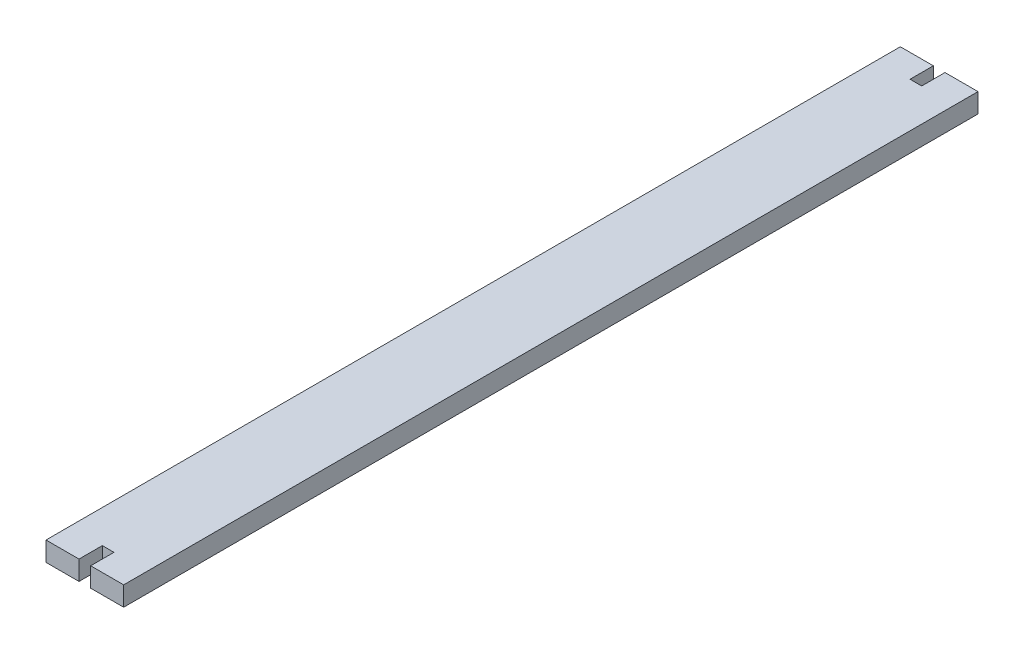
ISO-10303-21;
HEADER;
FILE_DESCRIPTION(('STEP AP214'),'2;1');
FILE_NAME('part.step','',(''),(''),'','','');
FILE_SCHEMA(('AUTOMOTIVE_DESIGN { 1 0 10303 214 1 1 1 1 }'));
ENDSEC;
DATA;
#1=APPLICATION_CONTEXT('core data for automotive mechanical design processes');
#2=APPLICATION_PROTOCOL_DEFINITION('international standard','automotive_design',2000,#1);
#3=PRODUCT_CONTEXT('',#1,'mechanical');
#4=PRODUCT('Part','Part','',(#3));
#5=PRODUCT_RELATED_PRODUCT_CATEGORY('part','',(#4));
#6=PRODUCT_DEFINITION_FORMATION('','',#4);
#7=PRODUCT_DEFINITION_CONTEXT('part definition',#1,'design');
#8=PRODUCT_DEFINITION('design','',#6,#7);
#9=PRODUCT_DEFINITION_SHAPE('','',#8);
#10=(LENGTH_UNIT() NAMED_UNIT(*) SI_UNIT(.MILLI.,.METRE.));
#11=(NAMED_UNIT(*) PLANE_ANGLE_UNIT() SI_UNIT($,.RADIAN.));
#12=(NAMED_UNIT(*) SI_UNIT($,.STERADIAN.) SOLID_ANGLE_UNIT());
#13=UNCERTAINTY_MEASURE_WITH_UNIT(LENGTH_MEASURE(1.E-05),#10,'distance_accuracy_value','');
#14=(GEOMETRIC_REPRESENTATION_CONTEXT(3) GLOBAL_UNCERTAINTY_ASSIGNED_CONTEXT((#13)) GLOBAL_UNIT_ASSIGNED_CONTEXT((#10,
#11,#12)) REPRESENTATION_CONTEXT('',''));
#15=CARTESIAN_POINT('',(0.,0.,0.));
#16=DIRECTION('',(0.,0.,1.));
#17=DIRECTION('',(1.,0.,0.));
#18=AXIS2_PLACEMENT_3D('',#15,#16,#17);
#19=CARTESIAN_POINT('',(10.,-5.,-110.));
#20=DIRECTION('',(0.,0.,-1.));
#21=DIRECTION('',(-1.,0.,0.));
#22=AXIS2_PLACEMENT_3D('',#19,#20,#21);
#23=PLANE('',#22);
#24=DIRECTION('',(0.,1.,0.));
#25=VECTOR('',#24,1.);
#26=CARTESIAN_POINT('',(-1.49999999999999,-5.,-110.));
#27=LINE('',#26,#25);
#28=CARTESIAN_POINT('',(-1.49999999999999,-5.,-110.));
#29=VERTEX_POINT('',#28);
#30=CARTESIAN_POINT('',(-1.49999999999999,0.,-110.));
#31=VERTEX_POINT('',#30);
#32=EDGE_CURVE('E163',#29,#31,#27,.T.);
#33=ORIENTED_EDGE('',*,*,#32,.F.);
#34=DIRECTION('',(-1.,0.,0.));
#35=VECTOR('',#34,1.);
#36=CARTESIAN_POINT('',(10.,-5.,-110.));
#37=LINE('',#36,#35);
#38=CARTESIAN_POINT('',(-9.99999999999999,-5.,-110.));
#39=VERTEX_POINT('',#38);
#40=EDGE_CURVE('E153',#29,#39,#37,.T.);
#41=ORIENTED_EDGE('',*,*,#40,.T.);
#42=DIRECTION('',(0.,1.,0.));
#43=VECTOR('',#42,1.);
#44=CARTESIAN_POINT('',(-9.99999999999999,-5.,-110.));
#45=LINE('',#44,#43);
#46=CARTESIAN_POINT('',(-9.99999999999999,0.,-110.));
#47=VERTEX_POINT('',#46);
#48=EDGE_CURVE('E11',#39,#47,#45,.T.);
#49=ORIENTED_EDGE('',*,*,#48,.T.);
#50=DIRECTION('',(-1.,0.,0.));
#51=VECTOR('',#50,1.);
#52=CARTESIAN_POINT('',(10.,0.,-110.));
#53=LINE('',#52,#51);
#54=EDGE_CURVE('E216',#31,#47,#53,.T.);
#55=ORIENTED_EDGE('',*,*,#54,.F.);
#56=EDGE_LOOP('',(#33,#41,#49,#55));
#57=FACE_BOUND('',#56,.T.);
#58=ADVANCED_FACE('F42',(#57),#23,.T.);
#59=CARTESIAN_POINT('',(10.,-5.,110.));
#60=DIRECTION('',(0.,0.,1.));
#61=DIRECTION('',(1.,0.,0.));
#62=AXIS2_PLACEMENT_3D('',#59,#60,#61);
#63=PLANE('',#62);
#64=DIRECTION('',(0.,1.,0.));
#65=VECTOR('',#64,1.);
#66=CARTESIAN_POINT('',(-1.5,-5.,110.));
#67=LINE('',#66,#65);
#68=CARTESIAN_POINT('',(-1.5,-5.,110.));
#69=VERTEX_POINT('',#68);
#70=CARTESIAN_POINT('',(-1.5,0.,110.));
#71=VERTEX_POINT('',#70);
#72=EDGE_CURVE('E170',#69,#71,#67,.T.);
#73=ORIENTED_EDGE('',*,*,#72,.T.);
#74=DIRECTION('',(1.,0.,0.));
#75=VECTOR('',#74,1.);
#76=CARTESIAN_POINT('',(10.,0.,110.));
#77=LINE('',#76,#75);
#78=CARTESIAN_POINT('',(-9.99999999999999,0.,110.));
#79=VERTEX_POINT('',#78);
#80=EDGE_CURVE('E210',#79,#71,#77,.T.);
#81=ORIENTED_EDGE('',*,*,#80,.F.);
#82=DIRECTION('',(0.,1.,0.));
#83=VECTOR('',#82,1.);
#84=CARTESIAN_POINT('',(-9.99999999999999,-5.,110.));
#85=LINE('',#84,#83);
#86=CARTESIAN_POINT('',(-9.99999999999999,-5.,110.));
#87=VERTEX_POINT('',#86);
#88=EDGE_CURVE('E46',#87,#79,#85,.T.);
#89=ORIENTED_EDGE('',*,*,#88,.F.);
#90=DIRECTION('',(1.,0.,0.));
#91=VECTOR('',#90,1.);
#92=CARTESIAN_POINT('',(10.,-5.,110.));
#93=LINE('',#92,#91);
#94=EDGE_CURVE('E198',#87,#69,#93,.T.);
#95=ORIENTED_EDGE('',*,*,#94,.T.);
#96=EDGE_LOOP('',(#73,#81,#89,#95));
#97=FACE_BOUND('',#96,.T.);
#98=ADVANCED_FACE('F231',(#97),#63,.T.);
#99=CARTESIAN_POINT('',(-9.99999999999999,-5.,110.));
#100=DIRECTION('',(-1.,0.,0.));
#101=DIRECTION('',(0.,0.,1.));
#102=AXIS2_PLACEMENT_3D('',#99,#100,#101);
#103=PLANE('',#102);
#104=DIRECTION('',(0.,0.,1.));
#105=VECTOR('',#104,1.);
#106=CARTESIAN_POINT('',(-9.99999999999999,0.,110.));
#107=LINE('',#106,#105);
#108=EDGE_CURVE('E165',#47,#79,#107,.T.);
#109=ORIENTED_EDGE('',*,*,#108,.F.);
#110=ORIENTED_EDGE('',*,*,#48,.F.);
#111=DIRECTION('',(0.,0.,1.));
#112=VECTOR('',#111,1.);
#113=CARTESIAN_POINT('',(-9.99999999999999,-5.,110.));
#114=LINE('',#113,#112);
#115=EDGE_CURVE('E193',#39,#87,#114,.T.);
#116=ORIENTED_EDGE('',*,*,#115,.T.);
#117=ORIENTED_EDGE('',*,*,#88,.T.);
#118=EDGE_LOOP('',(#109,#110,#116,#117));
#119=FACE_BOUND('',#118,.T.);
#120=ADVANCED_FACE('F44',(#119),#103,.T.);
#121=DIRECTION('',(0.,1.,0.));
#122=VECTOR('',#121,1.);
#123=CARTESIAN_POINT('',(1.50000000000001,-5.,-110.));
#124=LINE('',#123,#122);
#125=CARTESIAN_POINT('',(1.50000000000001,-5.,-110.));
#126=VERTEX_POINT('',#125);
#127=CARTESIAN_POINT('',(1.50000000000001,0.,-110.));
#128=VERTEX_POINT('',#127);
#129=EDGE_CURVE('E166',#126,#128,#124,.T.);
#130=ORIENTED_EDGE('',*,*,#129,.T.);
#131=CARTESIAN_POINT('',(10.,0.,-110.));
#132=VERTEX_POINT('',#131);
#133=EDGE_CURVE('E197',#132,#128,#53,.T.);
#134=ORIENTED_EDGE('',*,*,#133,.F.);
#135=DIRECTION('',(0.,1.,0.));
#136=VECTOR('',#135,1.);
#137=CARTESIAN_POINT('',(10.,-5.,-110.));
#138=LINE('',#137,#136);
#139=CARTESIAN_POINT('',(10.,-5.,-110.));
#140=VERTEX_POINT('',#139);
#141=EDGE_CURVE('E51',#140,#132,#138,.T.);
#142=ORIENTED_EDGE('',*,*,#141,.F.);
#143=EDGE_CURVE('E204',#140,#126,#37,.T.);
#144=ORIENTED_EDGE('',*,*,#143,.T.);
#145=EDGE_LOOP('',(#130,#134,#142,#144));
#146=FACE_BOUND('',#145,.T.);
#147=ADVANCED_FACE('F257',(#146),#23,.T.);
#148=CARTESIAN_POINT('',(10.,-5.,110.));
#149=DIRECTION('',(1.,0.,0.));
#150=DIRECTION('',(0.,0.,-1.));
#151=AXIS2_PLACEMENT_3D('',#148,#149,#150);
#152=PLANE('',#151);
#153=DIRECTION('',(0.,0.,-1.));
#154=VECTOR('',#153,1.);
#155=CARTESIAN_POINT('',(10.,0.,110.));
#156=LINE('',#155,#154);
#157=CARTESIAN_POINT('',(10.,0.,110.));
#158=VERTEX_POINT('',#157);
#159=EDGE_CURVE('E213',#158,#132,#156,.T.);
#160=ORIENTED_EDGE('',*,*,#159,.F.);
#161=DIRECTION('',(0.,1.,0.));
#162=VECTOR('',#161,1.);
#163=CARTESIAN_POINT('',(10.,-5.,110.));
#164=LINE('',#163,#162);
#165=CARTESIAN_POINT('',(10.,-5.,110.));
#166=VERTEX_POINT('',#165);
#167=EDGE_CURVE('E219',#166,#158,#164,.T.);
#168=ORIENTED_EDGE('',*,*,#167,.F.);
#169=DIRECTION('',(0.,0.,-1.));
#170=VECTOR('',#169,1.);
#171=CARTESIAN_POINT('',(10.,-5.,110.));
#172=LINE('',#171,#170);
#173=EDGE_CURVE('E201',#166,#140,#172,.T.);
#174=ORIENTED_EDGE('',*,*,#173,.T.);
#175=ORIENTED_EDGE('',*,*,#141,.T.);
#176=EDGE_LOOP('',(#160,#168,#174,#175));
#177=FACE_BOUND('',#176,.T.);
#178=ADVANCED_FACE('F266',(#177),#152,.T.);
#179=DIRECTION('',(0.,1.,0.));
#180=VECTOR('',#179,1.);
#181=CARTESIAN_POINT('',(1.49999999999999,-5.,110.));
#182=LINE('',#181,#180);
#183=CARTESIAN_POINT('',(1.49999999999999,-5.,110.));
#184=VERTEX_POINT('',#183);
#185=CARTESIAN_POINT('',(1.49999999999999,0.,110.));
#186=VERTEX_POINT('',#185);
#187=EDGE_CURVE('E67',#184,#186,#182,.T.);
#188=ORIENTED_EDGE('',*,*,#187,.F.);
#189=EDGE_CURVE('E196',#184,#166,#93,.T.);
#190=ORIENTED_EDGE('',*,*,#189,.T.);
#191=ORIENTED_EDGE('',*,*,#167,.T.);
#192=EDGE_CURVE('E209',#186,#158,#77,.T.);
#193=ORIENTED_EDGE('',*,*,#192,.F.);
#194=EDGE_LOOP('',(#188,#190,#191,#193));
#195=FACE_BOUND('',#194,.T.);
#196=ADVANCED_FACE('F262',(#195),#63,.T.);
#197=CARTESIAN_POINT('',(0.,-5.,0.));
#198=DIRECTION('',(0.,1.,0.));
#199=DIRECTION('',(0.,0.,1.));
#200=AXIS2_PLACEMENT_3D('',#197,#198,#199);
#201=PLANE('',#200);
#202=ORIENTED_EDGE('',*,*,#40,.F.);
#203=DIRECTION('',(0.,0.,1.));
#204=VECTOR('',#203,1.);
#205=CARTESIAN_POINT('',(-1.49999999999999,-5.,-104.));
#206=LINE('',#205,#204);
#207=CARTESIAN_POINT('',(-1.49999999999999,-5.,-104.));
#208=VERTEX_POINT('',#207);
#209=EDGE_CURVE('E135',#29,#208,#206,.T.);
#210=ORIENTED_EDGE('',*,*,#209,.T.);
#211=DIRECTION('',(1.,0.,0.));
#212=VECTOR('',#211,1.);
#213=CARTESIAN_POINT('',(1.50000000000001,-5.,-104.));
#214=LINE('',#213,#212);
#215=CARTESIAN_POINT('',(1.50000000000001,-5.,-104.));
#216=VERTEX_POINT('',#215);
#217=EDGE_CURVE('E144',#208,#216,#214,.T.);
#218=ORIENTED_EDGE('',*,*,#217,.T.);
#219=DIRECTION('',(0.,0.,-1.));
#220=VECTOR('',#219,1.);
#221=CARTESIAN_POINT('',(1.50000000000001,-5.,-104.));
#222=LINE('',#221,#220);
#223=EDGE_CURVE('E141',#216,#126,#222,.T.);
#224=ORIENTED_EDGE('',*,*,#223,.T.);
#225=ORIENTED_EDGE('',*,*,#143,.F.);
#226=ORIENTED_EDGE('',*,*,#173,.F.);
#227=ORIENTED_EDGE('',*,*,#189,.F.);
#228=DIRECTION('',(0.,0.,-1.));
#229=VECTOR('',#228,1.);
#230=CARTESIAN_POINT('',(1.49999999999999,-5.,104.));
#231=LINE('',#230,#229);
#232=CARTESIAN_POINT('',(1.49999999999999,-5.,104.));
#233=VERTEX_POINT('',#232);
#234=EDGE_CURVE('E188',#184,#233,#231,.T.);
#235=ORIENTED_EDGE('',*,*,#234,.T.);
#236=DIRECTION('',(-1.,0.,0.));
#237=VECTOR('',#236,1.);
#238=CARTESIAN_POINT('',(1.49999999999999,-5.,104.));
#239=LINE('',#238,#237);
#240=CARTESIAN_POINT('',(-1.5,-5.,104.));
#241=VERTEX_POINT('',#240);
#242=EDGE_CURVE('E173',#233,#241,#239,.T.);
#243=ORIENTED_EDGE('',*,*,#242,.T.);
#244=DIRECTION('',(0.,0.,1.));
#245=VECTOR('',#244,1.);
#246=CARTESIAN_POINT('',(-1.5,-5.,104.));
#247=LINE('',#246,#245);
#248=EDGE_CURVE('E183',#241,#69,#247,.T.);
#249=ORIENTED_EDGE('',*,*,#248,.T.);
#250=ORIENTED_EDGE('',*,*,#94,.F.);
#251=ORIENTED_EDGE('',*,*,#115,.F.);
#252=EDGE_LOOP('',(#202,#210,#218,#224,#225,#226,#227,#235,#243,#249,#250,#251));
#253=FACE_BOUND('',#252,.T.);
#254=ADVANCED_FACE('F151',(#253),#201,.F.);
#255=CARTESIAN_POINT('',(0.,0.,0.));
#256=DIRECTION('',(0.,1.,0.));
#257=DIRECTION('',(0.,0.,1.));
#258=AXIS2_PLACEMENT_3D('',#255,#256,#257);
#259=PLANE('',#258);
#260=DIRECTION('',(0.,0.,1.));
#261=VECTOR('',#260,1.);
#262=CARTESIAN_POINT('',(-1.49999999999999,0.,-104.));
#263=LINE('',#262,#261);
#264=CARTESIAN_POINT('',(-1.49999999999999,0.,-104.));
#265=VERTEX_POINT('',#264);
#266=EDGE_CURVE('E59',#31,#265,#263,.T.);
#267=ORIENTED_EDGE('',*,*,#266,.F.);
#268=ORIENTED_EDGE('',*,*,#54,.T.);
#269=ORIENTED_EDGE('',*,*,#108,.T.);
#270=ORIENTED_EDGE('',*,*,#80,.T.);
#271=DIRECTION('',(0.,0.,1.));
#272=VECTOR('',#271,1.);
#273=CARTESIAN_POINT('',(-1.5,0.,104.));
#274=LINE('',#273,#272);
#275=CARTESIAN_POINT('',(-1.5,0.,104.));
#276=VERTEX_POINT('',#275);
#277=EDGE_CURVE('E161',#276,#71,#274,.T.);
#278=ORIENTED_EDGE('',*,*,#277,.F.);
#279=DIRECTION('',(-1.,0.,0.));
#280=VECTOR('',#279,1.);
#281=CARTESIAN_POINT('',(1.49999999999999,0.,104.));
#282=LINE('',#281,#280);
#283=CARTESIAN_POINT('',(1.49999999999999,0.,104.));
#284=VERTEX_POINT('',#283);
#285=EDGE_CURVE('E179',#284,#276,#282,.T.);
#286=ORIENTED_EDGE('',*,*,#285,.F.);
#287=DIRECTION('',(0.,0.,-1.));
#288=VECTOR('',#287,1.);
#289=CARTESIAN_POINT('',(1.49999999999999,0.,104.));
#290=LINE('',#289,#288);
#291=EDGE_CURVE('E182',#186,#284,#290,.T.);
#292=ORIENTED_EDGE('',*,*,#291,.F.);
#293=ORIENTED_EDGE('',*,*,#192,.T.);
#294=ORIENTED_EDGE('',*,*,#159,.T.);
#295=ORIENTED_EDGE('',*,*,#133,.T.);
#296=DIRECTION('',(0.,0.,-1.));
#297=VECTOR('',#296,1.);
#298=CARTESIAN_POINT('',(1.50000000000001,0.,-104.));
#299=LINE('',#298,#297);
#300=CARTESIAN_POINT('',(1.50000000000001,0.,-104.));
#301=VERTEX_POINT('',#300);
#302=EDGE_CURVE('E154',#301,#128,#299,.T.);
#303=ORIENTED_EDGE('',*,*,#302,.F.);
#304=DIRECTION('',(1.,0.,0.));
#305=VECTOR('',#304,1.);
#306=CARTESIAN_POINT('',(1.50000000000001,0.,-104.));
#307=LINE('',#306,#305);
#308=EDGE_CURVE('E156',#265,#301,#307,.T.);
#309=ORIENTED_EDGE('',*,*,#308,.F.);
#310=EDGE_LOOP('',(#267,#268,#269,#270,#278,#286,#292,#293,#294,#295,#303,#309));
#311=FACE_BOUND('',#310,.T.);
#312=ADVANCED_FACE('F234',(#311),#259,.T.);
#313=CARTESIAN_POINT('',(-1.5,-5.,104.));
#314=DIRECTION('',(-1.,0.,0.));
#315=DIRECTION('',(0.,0.,1.));
#316=AXIS2_PLACEMENT_3D('',#313,#314,#315);
#317=PLANE('',#316);
#318=ORIENTED_EDGE('',*,*,#277,.T.);
#319=ORIENTED_EDGE('',*,*,#72,.F.);
#320=ORIENTED_EDGE('',*,*,#248,.F.);
#321=DIRECTION('',(0.,1.,0.));
#322=VECTOR('',#321,1.);
#323=CARTESIAN_POINT('',(-1.5,-5.,104.));
#324=LINE('',#323,#322);
#325=EDGE_CURVE('E177',#241,#276,#324,.T.);
#326=ORIENTED_EDGE('',*,*,#325,.T.);
#327=EDGE_LOOP('',(#318,#319,#320,#326));
#328=FACE_BOUND('',#327,.T.);
#329=ADVANCED_FACE('F240',(#328),#317,.F.);
#330=CARTESIAN_POINT('',(1.49999999999999,-5.,104.));
#331=DIRECTION('',(0.,0.,-1.));
#332=DIRECTION('',(-1.,0.,0.));
#333=AXIS2_PLACEMENT_3D('',#330,#331,#332);
#334=PLANE('',#333);
#335=ORIENTED_EDGE('',*,*,#285,.T.);
#336=ORIENTED_EDGE('',*,*,#325,.F.);
#337=ORIENTED_EDGE('',*,*,#242,.F.);
#338=DIRECTION('',(0.,1.,0.));
#339=VECTOR('',#338,1.);
#340=CARTESIAN_POINT('',(1.49999999999999,-5.,104.));
#341=LINE('',#340,#339);
#342=EDGE_CURVE('E175',#233,#284,#341,.T.);
#343=ORIENTED_EDGE('',*,*,#342,.T.);
#344=EDGE_LOOP('',(#335,#336,#337,#343));
#345=FACE_BOUND('',#344,.T.);
#346=ADVANCED_FACE('F243',(#345),#334,.F.);
#347=CARTESIAN_POINT('',(1.49999999999999,-5.,104.));
#348=DIRECTION('',(1.,0.,0.));
#349=DIRECTION('',(0.,0.,-1.));
#350=AXIS2_PLACEMENT_3D('',#347,#348,#349);
#351=PLANE('',#350);
#352=ORIENTED_EDGE('',*,*,#291,.T.);
#353=ORIENTED_EDGE('',*,*,#342,.F.);
#354=ORIENTED_EDGE('',*,*,#234,.F.);
#355=ORIENTED_EDGE('',*,*,#187,.T.);
#356=EDGE_LOOP('',(#352,#353,#354,#355));
#357=FACE_BOUND('',#356,.T.);
#358=ADVANCED_FACE('F244',(#357),#351,.F.);
#359=CARTESIAN_POINT('',(-1.49999999999999,-5.,-104.));
#360=DIRECTION('',(-1.,0.,0.));
#361=DIRECTION('',(0.,0.,1.));
#362=AXIS2_PLACEMENT_3D('',#359,#360,#361);
#363=PLANE('',#362);
#364=ORIENTED_EDGE('',*,*,#266,.T.);
#365=DIRECTION('',(0.,1.,0.));
#366=VECTOR('',#365,1.);
#367=CARTESIAN_POINT('',(-1.49999999999999,-5.,-104.));
#368=LINE('',#367,#366);
#369=EDGE_CURVE('E131',#208,#265,#368,.T.);
#370=ORIENTED_EDGE('',*,*,#369,.F.);
#371=ORIENTED_EDGE('',*,*,#209,.F.);
#372=ORIENTED_EDGE('',*,*,#32,.T.);
#373=EDGE_LOOP('',(#364,#370,#371,#372));
#374=FACE_BOUND('',#373,.T.);
#375=ADVANCED_FACE('F133',(#374),#363,.F.);
#376=CARTESIAN_POINT('',(1.50000000000001,-5.,-104.));
#377=DIRECTION('',(1.,0.,0.));
#378=DIRECTION('',(0.,0.,-1.));
#379=AXIS2_PLACEMENT_3D('',#376,#377,#378);
#380=PLANE('',#379);
#381=ORIENTED_EDGE('',*,*,#302,.T.);
#382=ORIENTED_EDGE('',*,*,#129,.F.);
#383=ORIENTED_EDGE('',*,*,#223,.F.);
#384=DIRECTION('',(0.,1.,0.));
#385=VECTOR('',#384,1.);
#386=CARTESIAN_POINT('',(1.50000000000001,-5.,-104.));
#387=LINE('',#386,#385);
#388=EDGE_CURVE('E140',#216,#301,#387,.T.);
#389=ORIENTED_EDGE('',*,*,#388,.T.);
#390=EDGE_LOOP('',(#381,#382,#383,#389));
#391=FACE_BOUND('',#390,.T.);
#392=ADVANCED_FACE('F251',(#391),#380,.F.);
#393=CARTESIAN_POINT('',(1.50000000000001,-5.,-104.));
#394=DIRECTION('',(0.,0.,1.));
#395=DIRECTION('',(1.,0.,0.));
#396=AXIS2_PLACEMENT_3D('',#393,#394,#395);
#397=PLANE('',#396);
#398=ORIENTED_EDGE('',*,*,#308,.T.);
#399=ORIENTED_EDGE('',*,*,#388,.F.);
#400=ORIENTED_EDGE('',*,*,#217,.F.);
#401=ORIENTED_EDGE('',*,*,#369,.T.);
#402=EDGE_LOOP('',(#398,#399,#400,#401));
#403=FACE_BOUND('',#402,.T.);
#404=ADVANCED_FACE('F145',(#403),#397,.F.);
#405=CLOSED_SHELL('',(#58,#98,#120,#147,#178,#196,#254,#312,#329,#346,#358,#375,#392,#404));
#406=MANIFOLD_SOLID_BREP('B2',#405);
#407=ADVANCED_BREP_SHAPE_REPRESENTATION('',(#18,#406),#14);
#408=SHAPE_DEFINITION_REPRESENTATION(#9,#407);
ENDSEC;
END-ISO-10303-21;
